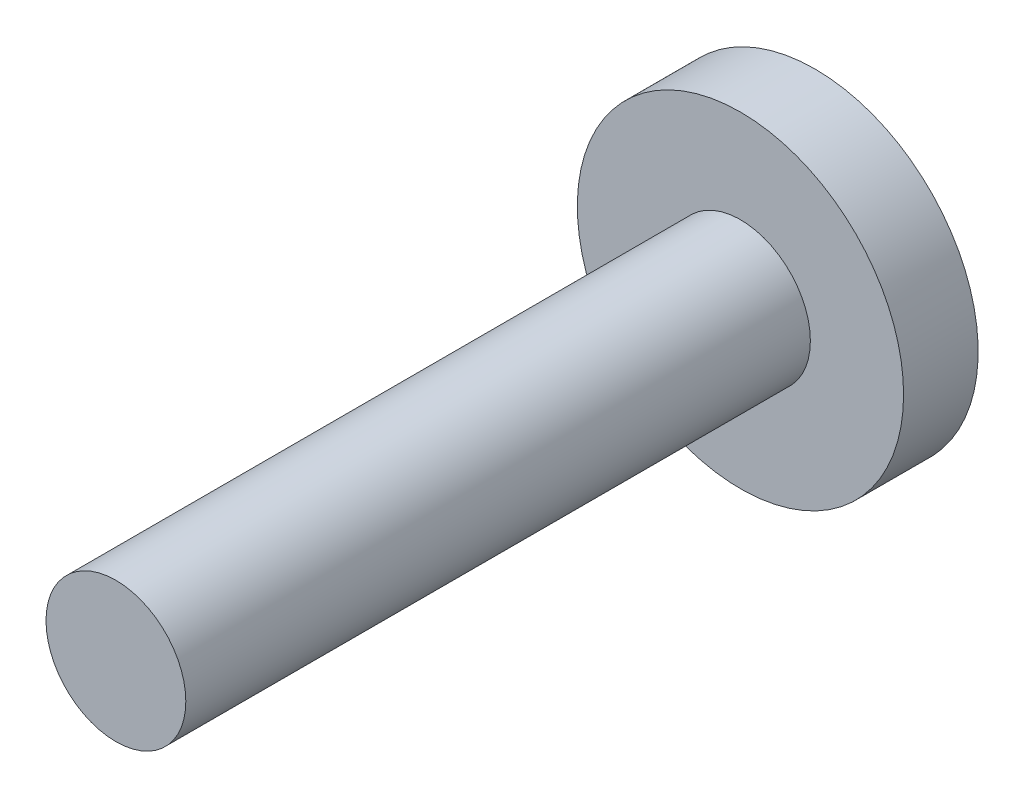
ISO-10303-21;
HEADER;
FILE_DESCRIPTION(('STEP AP214'),'2;1');
FILE_NAME('part.step','',(''),(''),'','','');
FILE_SCHEMA(('AUTOMOTIVE_DESIGN { 1 0 10303 214 1 1 1 1 }'));
ENDSEC;
DATA;
#1=APPLICATION_CONTEXT('core data for automotive mechanical design processes');
#2=APPLICATION_PROTOCOL_DEFINITION('international standard','automotive_design',2000,#1);
#3=PRODUCT_CONTEXT('',#1,'mechanical');
#4=PRODUCT('Part','Part','',(#3));
#5=PRODUCT_RELATED_PRODUCT_CATEGORY('part','',(#4));
#6=PRODUCT_DEFINITION_FORMATION('','',#4);
#7=PRODUCT_DEFINITION_CONTEXT('part definition',#1,'design');
#8=PRODUCT_DEFINITION('design','',#6,#7);
#9=PRODUCT_DEFINITION_SHAPE('','',#8);
#10=(LENGTH_UNIT() NAMED_UNIT(*) SI_UNIT(.MILLI.,.METRE.));
#11=(NAMED_UNIT(*) PLANE_ANGLE_UNIT() SI_UNIT($,.RADIAN.));
#12=(NAMED_UNIT(*) SI_UNIT($,.STERADIAN.) SOLID_ANGLE_UNIT());
#13=UNCERTAINTY_MEASURE_WITH_UNIT(LENGTH_MEASURE(1.E-05),#10,'distance_accuracy_value','');
#14=(GEOMETRIC_REPRESENTATION_CONTEXT(3) GLOBAL_UNCERTAINTY_ASSIGNED_CONTEXT((#13)) GLOBAL_UNIT_ASSIGNED_CONTEXT((#10,
#11,#12)) REPRESENTATION_CONTEXT('',''));
#15=CARTESIAN_POINT('',(0.,0.,0.));
#16=DIRECTION('',(0.,0.,1.));
#17=DIRECTION('',(1.,0.,0.));
#18=AXIS2_PLACEMENT_3D('',#15,#16,#17);
#19=CARTESIAN_POINT('',(45.8855643862837,144.956236842962,352.374757541018));
#20=DIRECTION('',(0.,0.,-1.));
#21=DIRECTION('',(0.,-1.,0.));
#22=AXIS2_PLACEMENT_3D('',#19,#20,#21);
#23=PLANE('',#22);
#24=DIRECTION('',(0.,-1.,0.));
#25=VECTOR('',#24,1.);
#26=CARTESIAN_POINT('',(44.6355643862837,145.67792467945,352.374757541018));
#27=LINE('',#26,#25);
#28=CARTESIAN_POINT('',(44.6355643862837,145.67792467945,352.374757541018));
#29=VERTEX_POINT('',#28);
#30=CARTESIAN_POINT('',(44.6355643862837,144.234549006475,352.374757541018));
#31=VERTEX_POINT('',#30);
#32=EDGE_CURVE('E190',#29,#31,#27,.T.);
#33=ORIENTED_EDGE('',*,*,#32,.F.);
#34=DIRECTION('',(-0.866025403784439,-0.5,0.));
#35=VECTOR('',#34,1.);
#36=CARTESIAN_POINT('',(45.8855643862837,146.399612515937,352.374757541018));
#37=LINE('',#36,#35);
#38=CARTESIAN_POINT('',(45.8855643862837,146.399612515937,352.374757541018));
#39=VERTEX_POINT('',#38);
#40=EDGE_CURVE('E143',#39,#29,#37,.T.);
#41=ORIENTED_EDGE('',*,*,#40,.F.);
#42=DIRECTION('',(-0.866025403784439,0.5,0.));
#43=VECTOR('',#42,1.);
#44=CARTESIAN_POINT('',(47.1355643862837,145.677924679449,352.374757541018));
#45=LINE('',#44,#43);
#46=CARTESIAN_POINT('',(47.1355643862837,145.677924679449,352.374757541018));
#47=VERTEX_POINT('',#46);
#48=EDGE_CURVE('E142',#47,#39,#45,.T.);
#49=ORIENTED_EDGE('',*,*,#48,.F.);
#50=DIRECTION('',(0.,1.,0.));
#51=VECTOR('',#50,1.);
#52=CARTESIAN_POINT('',(47.1355643862837,144.234549006475,352.374757541018));
#53=LINE('',#52,#51);
#54=CARTESIAN_POINT('',(47.1355643862837,144.234549006475,352.374757541018));
#55=VERTEX_POINT('',#54);
#56=EDGE_CURVE('E46',#55,#47,#53,.T.);
#57=ORIENTED_EDGE('',*,*,#56,.F.);
#58=DIRECTION('',(-0.866025403784439,-0.5,0.));
#59=VECTOR('',#58,1.);
#60=CARTESIAN_POINT('',(45.8855643862837,143.512861169988,352.374757541018));
#61=LINE('',#60,#59);
#62=CARTESIAN_POINT('',(45.8855643862837,143.512861169988,352.374757541018));
#63=VERTEX_POINT('',#62);
#64=EDGE_CURVE('E53',#55,#63,#61,.T.);
#65=ORIENTED_EDGE('',*,*,#64,.T.);
#66=DIRECTION('',(-0.866025403784438,0.5,0.));
#67=VECTOR('',#66,1.);
#68=CARTESIAN_POINT('',(44.6355643862837,144.234549006475,352.374757541018));
#69=LINE('',#68,#67);
#70=EDGE_CURVE('E11',#63,#31,#69,.T.);
#71=ORIENTED_EDGE('',*,*,#70,.T.);
#72=EDGE_LOOP('',(#33,#41,#49,#57,#65,#71));
#73=FACE_BOUND('',#72,.T.);
#74=ADVANCED_FACE('F42',(#73),#23,.T.);
#75=CARTESIAN_POINT('',(44.6355643862837,144.234549006475,348.174757541018));
#76=DIRECTION('',(0.5,0.866025403784438,0.));
#77=DIRECTION('',(0.,0.,-1.));
#78=AXIS2_PLACEMENT_3D('',#75,#76,#77);
#79=PLANE('',#78);
#80=DIRECTION('',(0.,0.,-1.));
#81=VECTOR('',#80,1.);
#82=CARTESIAN_POINT('',(45.8855643862837,143.512861169988,348.174757541018));
#83=LINE('',#82,#81);
#84=CARTESIAN_POINT('',(45.8855643862837,143.512861169988,351.374757541018));
#85=VERTEX_POINT('',#84);
#86=EDGE_CURVE('E209',#63,#85,#83,.T.);
#87=ORIENTED_EDGE('',*,*,#86,.T.);
#88=DIRECTION('',(-0.866025403784438,0.5,0.));
#89=VECTOR('',#88,1.);
#90=CARTESIAN_POINT('',(45.2605643862837,143.873705088232,351.374757541018));
#91=LINE('',#90,#89);
#92=CARTESIAN_POINT('',(44.6355643862837,144.234549006475,351.374757541018));
#93=VERTEX_POINT('',#92);
#94=EDGE_CURVE('E165',#85,#93,#91,.T.);
#95=ORIENTED_EDGE('',*,*,#94,.T.);
#96=DIRECTION('',(0.,0.,-1.));
#97=VECTOR('',#96,1.);
#98=CARTESIAN_POINT('',(44.6355643862837,144.234549006475,348.174757541018));
#99=LINE('',#98,#97);
#100=EDGE_CURVE('E182',#31,#93,#99,.T.);
#101=ORIENTED_EDGE('',*,*,#100,.F.);
#102=ORIENTED_EDGE('',*,*,#70,.F.);
#103=EDGE_LOOP('',(#87,#95,#101,#102));
#104=FACE_BOUND('',#103,.T.);
#105=ADVANCED_FACE('F228',(#104),#79,.T.);
#106=CARTESIAN_POINT('',(45.8855643862837,143.512861169988,348.174757541018));
#107=DIRECTION('',(-0.5,0.866025403784439,0.));
#108=DIRECTION('',(0.,0.,1.));
#109=AXIS2_PLACEMENT_3D('',#106,#107,#108);
#110=PLANE('',#109);
#111=DIRECTION('',(0.,0.,-1.));
#112=VECTOR('',#111,1.);
#113=CARTESIAN_POINT('',(47.1355643862837,144.234549006475,348.174757541018));
#114=LINE('',#113,#112);
#115=CARTESIAN_POINT('',(47.1355643862837,144.234549006475,351.374757541018));
#116=VERTEX_POINT('',#115);
#117=EDGE_CURVE('E185',#55,#116,#114,.T.);
#118=ORIENTED_EDGE('',*,*,#117,.T.);
#119=DIRECTION('',(-0.866025403784439,-0.5,0.));
#120=VECTOR('',#119,1.);
#121=CARTESIAN_POINT('',(46.5105643862837,143.873705088232,351.374757541018));
#122=LINE('',#121,#120);
#123=EDGE_CURVE('E159',#116,#85,#122,.T.);
#124=ORIENTED_EDGE('',*,*,#123,.T.);
#125=ORIENTED_EDGE('',*,*,#86,.F.);
#126=ORIENTED_EDGE('',*,*,#64,.F.);
#127=EDGE_LOOP('',(#118,#124,#125,#126));
#128=FACE_BOUND('',#127,.T.);
#129=ADVANCED_FACE('F256',(#128),#110,.T.);
#130=CARTESIAN_POINT('',(47.1355643862837,144.234549006475,348.174757541018));
#131=DIRECTION('',(-1.,0.,0.));
#132=DIRECTION('',(0.,0.,1.));
#133=AXIS2_PLACEMENT_3D('',#130,#131,#132);
#134=PLANE('',#133);
#135=DIRECTION('',(0.,0.,-1.));
#136=VECTOR('',#135,1.);
#137=CARTESIAN_POINT('',(47.1355643862837,145.677924679449,348.174757541018));
#138=LINE('',#137,#136);
#139=CARTESIAN_POINT('',(47.1355643862837,145.677924679449,351.374757541018));
#140=VERTEX_POINT('',#139);
#141=EDGE_CURVE('E131',#47,#140,#138,.T.);
#142=ORIENTED_EDGE('',*,*,#141,.T.);
#143=DIRECTION('',(0.,-1.,0.));
#144=VECTOR('',#143,1.);
#145=CARTESIAN_POINT('',(47.1355643862837,144.956236842962,351.374757541018));
#146=LINE('',#145,#144);
#147=EDGE_CURVE('E136',#140,#116,#146,.T.);
#148=ORIENTED_EDGE('',*,*,#147,.T.);
#149=ORIENTED_EDGE('',*,*,#117,.F.);
#150=ORIENTED_EDGE('',*,*,#56,.T.);
#151=EDGE_LOOP('',(#142,#148,#149,#150));
#152=FACE_BOUND('',#151,.T.);
#153=ADVANCED_FACE('F133',(#152),#134,.T.);
#154=CARTESIAN_POINT('',(47.1355643862837,145.677924679449,348.174757541018));
#155=DIRECTION('',(-0.5,-0.866025403784439,0.));
#156=DIRECTION('',(-0.866025403784439,0.5,0.));
#157=AXIS2_PLACEMENT_3D('',#154,#155,#156);
#158=PLANE('',#157);
#159=DIRECTION('',(0.,0.,-1.));
#160=VECTOR('',#159,1.);
#161=CARTESIAN_POINT('',(45.8855643862837,146.399612515937,348.174757541018));
#162=LINE('',#161,#160);
#163=CARTESIAN_POINT('',(45.8855643862837,146.399612515937,351.374757541018));
#164=VERTEX_POINT('',#163);
#165=EDGE_CURVE('E149',#39,#164,#162,.T.);
#166=ORIENTED_EDGE('',*,*,#165,.T.);
#167=DIRECTION('',(0.866025403784439,-0.5,0.));
#168=VECTOR('',#167,1.);
#169=CARTESIAN_POINT('',(46.5105643862837,146.038768597693,351.374757541018));
#170=LINE('',#169,#168);
#171=EDGE_CURVE('E146',#164,#140,#170,.T.);
#172=ORIENTED_EDGE('',*,*,#171,.T.);
#173=ORIENTED_EDGE('',*,*,#141,.F.);
#174=ORIENTED_EDGE('',*,*,#48,.T.);
#175=EDGE_LOOP('',(#166,#172,#173,#174));
#176=FACE_BOUND('',#175,.T.);
#177=ADVANCED_FACE('F147',(#176),#158,.T.);
#178=CARTESIAN_POINT('',(45.8855643862837,146.399612515937,348.174757541018));
#179=DIRECTION('',(0.5,-0.866025403784439,0.));
#180=DIRECTION('',(0.,0.,-1.));
#181=AXIS2_PLACEMENT_3D('',#178,#179,#180);
#182=PLANE('',#181);
#183=DIRECTION('',(0.,0.,-1.));
#184=VECTOR('',#183,1.);
#185=CARTESIAN_POINT('',(44.6355643862837,145.67792467945,348.174757541018));
#186=LINE('',#185,#184);
#187=CARTESIAN_POINT('',(44.6355643862837,145.67792467945,351.374757541018));
#188=VERTEX_POINT('',#187);
#189=EDGE_CURVE('E93',#29,#188,#186,.T.);
#190=ORIENTED_EDGE('',*,*,#189,.T.);
#191=DIRECTION('',(0.866025403784439,0.5,0.));
#192=VECTOR('',#191,1.);
#193=CARTESIAN_POINT('',(45.2605643862837,146.038768597693,351.374757541018));
#194=LINE('',#193,#192);
#195=EDGE_CURVE('E153',#188,#164,#194,.T.);
#196=ORIENTED_EDGE('',*,*,#195,.T.);
#197=ORIENTED_EDGE('',*,*,#165,.F.);
#198=ORIENTED_EDGE('',*,*,#40,.T.);
#199=EDGE_LOOP('',(#190,#196,#197,#198));
#200=FACE_BOUND('',#199,.T.);
#201=ADVANCED_FACE('F220',(#200),#182,.T.);
#202=CARTESIAN_POINT('',(44.6355643862837,145.67792467945,348.174757541018));
#203=DIRECTION('',(1.,0.,0.));
#204=DIRECTION('',(0.,1.,0.));
#205=AXIS2_PLACEMENT_3D('',#202,#203,#204);
#206=PLANE('',#205);
#207=ORIENTED_EDGE('',*,*,#100,.T.);
#208=DIRECTION('',(0.,1.,0.));
#209=VECTOR('',#208,1.);
#210=CARTESIAN_POINT('',(44.6355643862837,144.956236842962,351.374757541018));
#211=LINE('',#210,#209);
#212=EDGE_CURVE('E174',#93,#188,#211,.T.);
#213=ORIENTED_EDGE('',*,*,#212,.T.);
#214=ORIENTED_EDGE('',*,*,#189,.F.);
#215=ORIENTED_EDGE('',*,*,#32,.T.);
#216=EDGE_LOOP('',(#207,#213,#214,#215));
#217=FACE_BOUND('',#216,.T.);
#218=ADVANCED_FACE('F245',(#217),#206,.T.);
#219=CARTESIAN_POINT('',(45.8855643862837,144.956236842962,366.374757541018));
#220=DIRECTION('',(0.,0.,1.));
#221=DIRECTION('',(1.,0.,0.));
#222=AXIS2_PLACEMENT_3D('',#219,#220,#221);
#223=PLANE('',#222);
#224=CARTESIAN_POINT('',(45.8855643862837,144.956236842962,366.374757541018));
#225=DIRECTION('',(0.,0.,-1.));
#226=DIRECTION('',(-1.,0.,0.));
#227=AXIS2_PLACEMENT_3D('',#224,#225,#226);
#228=CIRCLE('',#227,1.5);
#229=CARTESIAN_POINT('',(44.3855643862837,144.956236842962,366.374757541018));
#230=VERTEX_POINT('',#229);
#231=EDGE_CURVE('E171',#230,#230,#228,.T.);
#232=ORIENTED_EDGE('',*,*,#231,.F.);
#233=EDGE_LOOP('',(#232));
#234=FACE_BOUND('',#233,.T.);
#235=ADVANCED_FACE('F44',(#234),#223,.T.);
#236=CARTESIAN_POINT('',(45.8855643862837,144.956236842962,361.374757541018));
#237=DIRECTION('',(0.,0.,-1.));
#238=DIRECTION('',(1.,0.,0.));
#239=AXIS2_PLACEMENT_3D('',#236,#237,#238);
#240=CYLINDRICAL_SURFACE('',#239,1.5);
#241=CARTESIAN_POINT('',(45.8855643862837,144.956236842962,352.974757541019));
#242=DIRECTION('',(0.,0.,-1.));
#243=DIRECTION('',(1.,0.,0.));
#244=AXIS2_PLACEMENT_3D('',#241,#242,#243);
#245=CIRCLE('',#244,1.5);
#246=CARTESIAN_POINT('',(47.3855643862837,144.956236842962,352.974757541019));
#247=VERTEX_POINT('',#246);
#248=EDGE_CURVE('E169',#247,#247,#245,.T.);
#249=ORIENTED_EDGE('',*,*,#248,.F.);
#250=EDGE_LOOP('',(#249));
#251=FACE_BOUND('',#250,.T.);
#252=ORIENTED_EDGE('',*,*,#231,.T.);
#253=EDGE_LOOP('',(#252));
#254=FACE_BOUND('',#253,.T.);
#255=ADVANCED_FACE('F239',(#251,#254),#240,.T.);
#256=CARTESIAN_POINT('',(45.8855643862837,144.956236842962,352.974757541019));
#257=DIRECTION('',(0.,0.,-1.));
#258=DIRECTION('',(0.,-1.,0.));
#259=AXIS2_PLACEMENT_3D('',#256,#257,#258);
#260=PLANE('',#259);
#261=CARTESIAN_POINT('',(45.8855643862837,144.956236842962,352.974757541019));
#262=DIRECTION('',(0.,0.,-1.));
#263=DIRECTION('',(1.,0.,0.));
#264=AXIS2_PLACEMENT_3D('',#261,#262,#263);
#265=CIRCLE('',#264,3.5);
#266=CARTESIAN_POINT('',(49.3855643862837,144.956236842962,352.974757541019));
#267=VERTEX_POINT('',#266);
#268=EDGE_CURVE('E81',#267,#267,#265,.T.);
#269=ORIENTED_EDGE('',*,*,#268,.F.);
#270=EDGE_LOOP('',(#269));
#271=FACE_BOUND('',#270,.T.);
#272=ORIENTED_EDGE('',*,*,#248,.T.);
#273=EDGE_LOOP('',(#272));
#274=FACE_BOUND('',#273,.T.);
#275=ADVANCED_FACE('F234',(#271,#274),#260,.F.);
#276=CARTESIAN_POINT('',(45.8855643862837,144.956236842962,352.874757541018));
#277=DIRECTION('',(0.,0.,-1.));
#278=DIRECTION('',(-1.,0.,0.));
#279=AXIS2_PLACEMENT_3D('',#276,#277,#278);
#280=CYLINDRICAL_SURFACE('',#279,3.5);
#281=CARTESIAN_POINT('',(45.8855643862837,144.956236842962,351.374757541018));
#282=DIRECTION('',(0.,0.,-1.));
#283=DIRECTION('',(0.,1.,0.));
#284=AXIS2_PLACEMENT_3D('',#281,#282,#283);
#285=CIRCLE('',#284,3.5);
#286=CARTESIAN_POINT('',(45.8855643862837,148.456236842962,351.374757541018));
#287=VERTEX_POINT('',#286);
#288=EDGE_CURVE('E179',#287,#287,#285,.T.);
#289=ORIENTED_EDGE('',*,*,#288,.F.);
#290=EDGE_LOOP('',(#289));
#291=FACE_BOUND('',#290,.T.);
#292=ORIENTED_EDGE('',*,*,#268,.T.);
#293=EDGE_LOOP('',(#292));
#294=FACE_BOUND('',#293,.T.);
#295=ADVANCED_FACE('F238',(#291,#294),#280,.T.);
#296=CARTESIAN_POINT('',(45.8855643862837,144.956236842962,351.374757541018));
#297=DIRECTION('',(0.,0.,-1.));
#298=DIRECTION('',(0.,-1.,0.));
#299=AXIS2_PLACEMENT_3D('',#296,#297,#298);
#300=PLANE('',#299);
#301=ORIENTED_EDGE('',*,*,#94,.F.);
#302=ORIENTED_EDGE('',*,*,#123,.F.);
#303=ORIENTED_EDGE('',*,*,#147,.F.);
#304=ORIENTED_EDGE('',*,*,#171,.F.);
#305=ORIENTED_EDGE('',*,*,#195,.F.);
#306=ORIENTED_EDGE('',*,*,#212,.F.);
#307=EDGE_LOOP('',(#301,#302,#303,#304,#305,#306));
#308=FACE_BOUND('',#307,.T.);
#309=ORIENTED_EDGE('',*,*,#288,.T.);
#310=EDGE_LOOP('',(#309));
#311=FACE_BOUND('',#310,.T.);
#312=ADVANCED_FACE('F156',(#308,#311),#300,.T.);
#313=CLOSED_SHELL('',(#74,#105,#129,#153,#177,#201,#218,#235,#255,#275,#295,#312));
#314=MANIFOLD_SOLID_BREP('B2',#313);
#315=ADVANCED_BREP_SHAPE_REPRESENTATION('',(#18,#314),#14);
#316=SHAPE_DEFINITION_REPRESENTATION(#9,#315);
ENDSEC;
END-ISO-10303-21;
